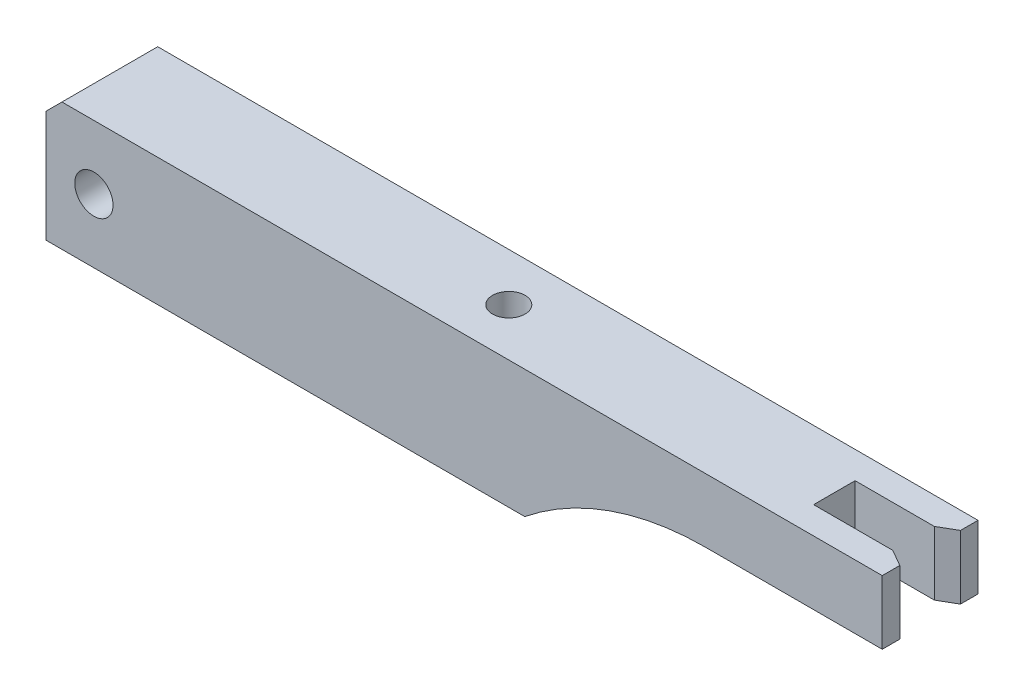
ISO-10303-21;
HEADER;
FILE_DESCRIPTION(('STEP AP214'),'2;1');
FILE_NAME('part.step','',(''),(''),'','','');
FILE_SCHEMA(('AUTOMOTIVE_DESIGN { 1 0 10303 214 1 1 1 1 }'));
ENDSEC;
DATA;
#1=APPLICATION_CONTEXT('core data for automotive mechanical design processes');
#2=APPLICATION_PROTOCOL_DEFINITION('international standard','automotive_design',2000,#1);
#3=PRODUCT_CONTEXT('',#1,'mechanical');
#4=PRODUCT('Part','Part','',(#3));
#5=PRODUCT_RELATED_PRODUCT_CATEGORY('part','',(#4));
#6=PRODUCT_DEFINITION_FORMATION('','',#4);
#7=PRODUCT_DEFINITION_CONTEXT('part definition',#1,'design');
#8=PRODUCT_DEFINITION('design','',#6,#7);
#9=PRODUCT_DEFINITION_SHAPE('','',#8);
#10=(LENGTH_UNIT() NAMED_UNIT(*) SI_UNIT(.MILLI.,.METRE.));
#11=(NAMED_UNIT(*) PLANE_ANGLE_UNIT() SI_UNIT($,.RADIAN.));
#12=(NAMED_UNIT(*) SI_UNIT($,.STERADIAN.) SOLID_ANGLE_UNIT());
#13=UNCERTAINTY_MEASURE_WITH_UNIT(LENGTH_MEASURE(1.E-05),#10,'distance_accuracy_value','');
#14=(GEOMETRIC_REPRESENTATION_CONTEXT(3) GLOBAL_UNCERTAINTY_ASSIGNED_CONTEXT((#13)) GLOBAL_UNIT_ASSIGNED_CONTEXT((#10,
#11,#12)) REPRESENTATION_CONTEXT('',''));
#15=CARTESIAN_POINT('',(0.,0.,0.));
#16=DIRECTION('',(0.,0.,1.));
#17=DIRECTION('',(1.,0.,0.));
#18=AXIS2_PLACEMENT_3D('',#15,#16,#17);
#19=CARTESIAN_POINT('',(132.,40.,15.));
#20=DIRECTION('',(-1.,0.,0.));
#21=DIRECTION('',(0.,0.,1.));
#22=AXIS2_PLACEMENT_3D('',#19,#20,#21);
#23=PLANE('',#22);
#24=DIRECTION('',(0.,0.,-1.));
#25=VECTOR('',#24,1.);
#26=CARTESIAN_POINT('',(132.,40.,15.));
#27=LINE('',#26,#25);
#28=CARTESIAN_POINT('',(132.,40.,-9.5));
#29=VERTEX_POINT('',#28);
#30=CARTESIAN_POINT('',(132.,40.,-15.));
#31=VERTEX_POINT('',#30);
#32=EDGE_CURVE('E244',#29,#31,#27,.T.);
#33=ORIENTED_EDGE('',*,*,#32,.F.);
#34=DIRECTION('',(0.,-1.,0.));
#35=VECTOR('',#34,1.);
#36=CARTESIAN_POINT('',(132.,40.,-9.5));
#37=LINE('',#36,#35);
#38=CARTESIAN_POINT('',(132.,20.,-9.5));
#39=VERTEX_POINT('',#38);
#40=EDGE_CURVE('E11',#29,#39,#37,.T.);
#41=ORIENTED_EDGE('',*,*,#40,.T.);
#42=DIRECTION('',(0.,0.,-1.));
#43=VECTOR('',#42,1.);
#44=CARTESIAN_POINT('',(132.,20.,15.));
#45=LINE('',#44,#43);
#46=CARTESIAN_POINT('',(132.,20.,-15.));
#47=VERTEX_POINT('',#46);
#48=EDGE_CURVE('E248',#39,#47,#45,.T.);
#49=ORIENTED_EDGE('',*,*,#48,.T.);
#50=DIRECTION('',(0.,1.,0.));
#51=VECTOR('',#50,1.);
#52=CARTESIAN_POINT('',(132.,40.,-15.));
#53=LINE('',#52,#51);
#54=EDGE_CURVE('E224',#47,#31,#53,.T.);
#55=ORIENTED_EDGE('',*,*,#54,.T.);
#56=EDGE_LOOP('',(#33,#41,#49,#55));
#57=FACE_BOUND('',#56,.T.);
#58=ADVANCED_FACE('F40',(#57),#23,.F.);
#59=CARTESIAN_POINT('',(76.5685424949238,-70.,15.));
#60=DIRECTION('',(0.,0.,-1.));
#61=DIRECTION('',(-1.,0.,0.));
#62=AXIS2_PLACEMENT_3D('',#59,#60,#61);
#63=CYLINDRICAL_SURFACE('',#62,90.);
#64=CARTESIAN_POINT('',(76.5685424949238,-70.,-15.));
#65=DIRECTION('',(0.,0.,-1.));
#66=DIRECTION('',(1.,0.,0.));
#67=AXIS2_PLACEMENT_3D('',#64,#65,#66);
#68=CIRCLE('',#67,90.);
#69=CARTESIAN_POINT('',(20.,0.,-15.));
#70=VERTEX_POINT('',#69);
#71=CARTESIAN_POINT('',(76.5685424949237,20.,-15.));
#72=VERTEX_POINT('',#71);
#73=EDGE_CURVE('E194',#70,#72,#68,.T.);
#74=ORIENTED_EDGE('',*,*,#73,.T.);
#75=DIRECTION('',(0.,0.,-1.));
#76=VECTOR('',#75,1.);
#77=CARTESIAN_POINT('',(76.5685424949237,20.,15.));
#78=LINE('',#77,#76);
#79=CARTESIAN_POINT('',(76.5685424949237,20.,15.));
#80=VERTEX_POINT('',#79);
#81=EDGE_CURVE('E253',#80,#72,#78,.T.);
#82=ORIENTED_EDGE('',*,*,#81,.F.);
#83=CARTESIAN_POINT('',(76.5685424949238,-70.,15.));
#84=DIRECTION('',(0.,0.,-1.));
#85=DIRECTION('',(1.,0.,0.));
#86=AXIS2_PLACEMENT_3D('',#83,#84,#85);
#87=CIRCLE('',#86,90.);
#88=CARTESIAN_POINT('',(20.,0.,15.));
#89=VERTEX_POINT('',#88);
#90=EDGE_CURVE('E195',#89,#80,#87,.T.);
#91=ORIENTED_EDGE('',*,*,#90,.F.);
#92=DIRECTION('',(0.,0.,-1.));
#93=VECTOR('',#92,1.);
#94=CARTESIAN_POINT('',(20.,0.,15.));
#95=LINE('',#94,#93);
#96=EDGE_CURVE('E216',#89,#70,#95,.T.);
#97=ORIENTED_EDGE('',*,*,#96,.T.);
#98=EDGE_LOOP('',(#74,#82,#91,#97));
#99=FACE_BOUND('',#98,.T.);
#100=ADVANCED_FACE('F371',(#99),#63,.F.);
#101=CARTESIAN_POINT('',(132.,20.,15.));
#102=DIRECTION('',(0.,1.,0.));
#103=DIRECTION('',(-1.,0.,0.));
#104=AXIS2_PLACEMENT_3D('',#101,#102,#103);
#105=PLANE('',#104);
#106=DIRECTION('',(1.,0.,0.));
#107=VECTOR('',#106,1.);
#108=CARTESIAN_POINT('',(132.,20.,6.5));
#109=LINE('',#108,#107);
#110=CARTESIAN_POINT('',(102.,20.,6.5));
#111=VERTEX_POINT('',#110);
#112=CARTESIAN_POINT('',(126.803847577293,20.,6.5));
#113=VERTEX_POINT('',#112);
#114=EDGE_CURVE('E156',#111,#113,#109,.T.);
#115=ORIENTED_EDGE('',*,*,#114,.T.);
#116=DIRECTION('',(-0.866025403784441,0.,-0.499999999999996));
#117=VECTOR('',#116,1.);
#118=CARTESIAN_POINT('',(132.,20.,9.5));
#119=LINE('',#118,#117);
#120=CARTESIAN_POINT('',(132.,20.,9.5));
#121=VERTEX_POINT('',#120);
#122=EDGE_CURVE('E285',#113,#121,#119,.F.);
#123=ORIENTED_EDGE('',*,*,#122,.T.);
#124=CARTESIAN_POINT('',(132.,20.,15.));
#125=VERTEX_POINT('',#124);
#126=EDGE_CURVE('E249',#125,#121,#45,.T.);
#127=ORIENTED_EDGE('',*,*,#126,.F.);
#128=DIRECTION('',(1.,0.,0.));
#129=VECTOR('',#128,1.);
#130=CARTESIAN_POINT('',(132.,20.,15.));
#131=LINE('',#130,#129);
#132=EDGE_CURVE('E199',#80,#125,#131,.T.);
#133=ORIENTED_EDGE('',*,*,#132,.F.);
#134=ORIENTED_EDGE('',*,*,#81,.T.);
#135=DIRECTION('',(1.,0.,0.));
#136=VECTOR('',#135,1.);
#137=CARTESIAN_POINT('',(132.,20.,-15.));
#138=LINE('',#137,#136);
#139=EDGE_CURVE('E220',#72,#47,#138,.T.);
#140=ORIENTED_EDGE('',*,*,#139,.T.);
#141=ORIENTED_EDGE('',*,*,#48,.F.);
#142=DIRECTION('',(0.866025403784441,0.,-0.499999999999996));
#143=VECTOR('',#142,1.);
#144=CARTESIAN_POINT('',(126.803847577293,20.,-6.5));
#145=LINE('',#144,#143);
#146=CARTESIAN_POINT('',(126.803847577293,20.,-6.5));
#147=VERTEX_POINT('',#146);
#148=EDGE_CURVE('E56',#39,#147,#145,.F.);
#149=ORIENTED_EDGE('',*,*,#148,.T.);
#150=DIRECTION('',(-1.,0.,0.));
#151=VECTOR('',#150,1.);
#152=CARTESIAN_POINT('',(132.,20.,-6.5));
#153=LINE('',#152,#151);
#154=CARTESIAN_POINT('',(102.,20.,-6.5));
#155=VERTEX_POINT('',#154);
#156=EDGE_CURVE('E173',#147,#155,#153,.T.);
#157=ORIENTED_EDGE('',*,*,#156,.T.);
#158=DIRECTION('',(0.,0.,1.));
#159=VECTOR('',#158,1.);
#160=CARTESIAN_POINT('',(102.,20.,15.));
#161=LINE('',#160,#159);
#162=EDGE_CURVE('E154',#155,#111,#161,.T.);
#163=ORIENTED_EDGE('',*,*,#162,.T.);
#164=EDGE_LOOP('',(#115,#123,#127,#133,#134,#140,#141,#149,#157,#163));
#165=FACE_BOUND('',#164,.T.);
#166=ADVANCED_FACE('F364',(#165),#105,.F.);
#167=ORIENTED_EDGE('',*,*,#126,.T.);
#168=DIRECTION('',(0.,1.,0.));
#169=VECTOR('',#168,1.);
#170=CARTESIAN_POINT('',(132.,40.,9.5));
#171=LINE('',#170,#169);
#172=CARTESIAN_POINT('',(132.,40.,9.5));
#173=VERTEX_POINT('',#172);
#174=EDGE_CURVE('E270',#121,#173,#171,.T.);
#175=ORIENTED_EDGE('',*,*,#174,.T.);
#176=CARTESIAN_POINT('',(132.,40.,15.));
#177=VERTEX_POINT('',#176);
#178=EDGE_CURVE('E245',#177,#173,#27,.T.);
#179=ORIENTED_EDGE('',*,*,#178,.F.);
#180=DIRECTION('',(0.,1.,0.));
#181=VECTOR('',#180,1.);
#182=CARTESIAN_POINT('',(132.,40.,15.));
#183=LINE('',#182,#181);
#184=EDGE_CURVE('E203',#125,#177,#183,.T.);
#185=ORIENTED_EDGE('',*,*,#184,.F.);
#186=EDGE_LOOP('',(#167,#175,#179,#185));
#187=FACE_BOUND('',#186,.T.);
#188=ADVANCED_FACE('F355',(#187),#23,.F.);
#189=CARTESIAN_POINT('',(-130.,40.,15.));
#190=DIRECTION('',(0.,-1.,0.));
#191=DIRECTION('',(0.,0.,-1.));
#192=AXIS2_PLACEMENT_3D('',#189,#190,#191);
#193=PLANE('',#192);
#194=CARTESIAN_POINT('',(0.,40.,0.));
#195=DIRECTION('',(0.,1.,0.));
#196=DIRECTION('',(0.,0.,1.));
#197=AXIS2_PLACEMENT_3D('',#194,#195,#196);
#198=CIRCLE('',#197,5.09999999999999);
#199=CARTESIAN_POINT('',(0.,40.,5.09999999999999));
#200=VERTEX_POINT('',#199);
#201=EDGE_CURVE('E182',#200,#200,#198,.T.);
#202=ORIENTED_EDGE('',*,*,#201,.F.);
#203=EDGE_LOOP('',(#202));
#204=FACE_BOUND('',#203,.T.);
#205=ORIENTED_EDGE('',*,*,#178,.T.);
#206=DIRECTION('',(0.866025403784441,0.,0.499999999999996));
#207=VECTOR('',#206,1.);
#208=CARTESIAN_POINT('',(132.,40.,9.5));
#209=LINE('',#208,#207);
#210=CARTESIAN_POINT('',(126.803847577293,40.,6.5));
#211=VERTEX_POINT('',#210);
#212=EDGE_CURVE('E277',#173,#211,#209,.F.);
#213=ORIENTED_EDGE('',*,*,#212,.T.);
#214=DIRECTION('',(1.,0.,0.));
#215=VECTOR('',#214,1.);
#216=CARTESIAN_POINT('',(102.,40.,6.5));
#217=LINE('',#216,#215);
#218=CARTESIAN_POINT('',(102.,40.,6.5));
#219=VERTEX_POINT('',#218);
#220=EDGE_CURVE('E145',#219,#211,#217,.T.);
#221=ORIENTED_EDGE('',*,*,#220,.F.);
#222=DIRECTION('',(0.,0.,1.));
#223=VECTOR('',#222,1.);
#224=CARTESIAN_POINT('',(102.,40.,6.5));
#225=LINE('',#224,#223);
#226=CARTESIAN_POINT('',(102.,40.,-6.5));
#227=VERTEX_POINT('',#226);
#228=EDGE_CURVE('E151',#227,#219,#225,.T.);
#229=ORIENTED_EDGE('',*,*,#228,.F.);
#230=DIRECTION('',(-1.,0.,0.));
#231=VECTOR('',#230,1.);
#232=CARTESIAN_POINT('',(102.,40.,-6.5));
#233=LINE('',#232,#231);
#234=CARTESIAN_POINT('',(126.803847577293,40.,-6.5));
#235=VERTEX_POINT('',#234);
#236=EDGE_CURVE('E136',#235,#227,#233,.T.);
#237=ORIENTED_EDGE('',*,*,#236,.F.);
#238=DIRECTION('',(-0.866025403784441,0.,0.499999999999996));
#239=VECTOR('',#238,1.);
#240=CARTESIAN_POINT('',(126.803847577293,40.,-6.5));
#241=LINE('',#240,#239);
#242=EDGE_CURVE('E274',#235,#29,#241,.F.);
#243=ORIENTED_EDGE('',*,*,#242,.T.);
#244=ORIENTED_EDGE('',*,*,#32,.T.);
#245=DIRECTION('',(-1.,0.,0.));
#246=VECTOR('',#245,1.);
#247=CARTESIAN_POINT('',(-130.,40.,-15.));
#248=LINE('',#247,#246);
#249=CARTESIAN_POINT('',(-125.,40.,-15.));
#250=VERTEX_POINT('',#249);
#251=EDGE_CURVE('E228',#31,#250,#248,.T.);
#252=ORIENTED_EDGE('',*,*,#251,.T.);
#253=DIRECTION('',(0.,0.,1.));
#254=VECTOR('',#253,1.);
#255=CARTESIAN_POINT('',(-125.,40.,15.));
#256=LINE('',#255,#254);
#257=CARTESIAN_POINT('',(-125.,40.,15.));
#258=VERTEX_POINT('',#257);
#259=EDGE_CURVE('E264',#250,#258,#256,.T.);
#260=ORIENTED_EDGE('',*,*,#259,.T.);
#261=DIRECTION('',(-1.,0.,0.));
#262=VECTOR('',#261,1.);
#263=CARTESIAN_POINT('',(-130.,40.,15.));
#264=LINE('',#263,#262);
#265=EDGE_CURVE('E206',#177,#258,#264,.T.);
#266=ORIENTED_EDGE('',*,*,#265,.F.);
#267=EDGE_LOOP('',(#205,#213,#221,#229,#237,#243,#244,#252,#260,#266));
#268=FACE_BOUND('',#267,.T.);
#269=ADVANCED_FACE('F160',(#204,#268),#193,.F.);
#270=CARTESIAN_POINT('',(-130.,0.,15.));
#271=DIRECTION('',(1.,0.,0.));
#272=DIRECTION('',(0.,0.,-1.));
#273=AXIS2_PLACEMENT_3D('',#270,#271,#272);
#274=PLANE('',#273);
#275=DIRECTION('',(0.,-1.,0.));
#276=VECTOR('',#275,1.);
#277=CARTESIAN_POINT('',(-130.,0.,15.));
#278=LINE('',#277,#276);
#279=CARTESIAN_POINT('',(-130.,35.,15.));
#280=VERTEX_POINT('',#279);
#281=CARTESIAN_POINT('',(-130.,0.,15.));
#282=VERTEX_POINT('',#281);
#283=EDGE_CURVE('E210',#280,#282,#278,.T.);
#284=ORIENTED_EDGE('',*,*,#283,.F.);
#285=DIRECTION('',(0.,0.,-1.));
#286=VECTOR('',#285,1.);
#287=CARTESIAN_POINT('',(-130.,35.,15.));
#288=LINE('',#287,#286);
#289=CARTESIAN_POINT('',(-130.,35.,-15.));
#290=VERTEX_POINT('',#289);
#291=EDGE_CURVE('E257',#280,#290,#288,.T.);
#292=ORIENTED_EDGE('',*,*,#291,.T.);
#293=DIRECTION('',(0.,-1.,0.));
#294=VECTOR('',#293,1.);
#295=CARTESIAN_POINT('',(-130.,0.,-15.));
#296=LINE('',#295,#294);
#297=CARTESIAN_POINT('',(-130.,0.,-15.));
#298=VERTEX_POINT('',#297);
#299=EDGE_CURVE('E232',#290,#298,#296,.T.);
#300=ORIENTED_EDGE('',*,*,#299,.T.);
#301=DIRECTION('',(0.,0.,-1.));
#302=VECTOR('',#301,1.);
#303=CARTESIAN_POINT('',(-130.,0.,15.));
#304=LINE('',#303,#302);
#305=EDGE_CURVE('E240',#282,#298,#304,.T.);
#306=ORIENTED_EDGE('',*,*,#305,.F.);
#307=EDGE_LOOP('',(#284,#292,#300,#306));
#308=FACE_BOUND('',#307,.T.);
#309=ADVANCED_FACE('F345',(#308),#274,.F.);
#310=CARTESIAN_POINT('',(20.,0.,15.));
#311=DIRECTION('',(0.,1.,0.));
#312=DIRECTION('',(-1.,0.,0.));
#313=AXIS2_PLACEMENT_3D('',#310,#311,#312);
#314=PLANE('',#313);
#315=CARTESIAN_POINT('',(0.,0.,0.));
#316=DIRECTION('',(0.,1.,0.));
#317=DIRECTION('',(0.,0.,1.));
#318=AXIS2_PLACEMENT_3D('',#315,#316,#317);
#319=CIRCLE('',#318,5.09999999999999);
#320=CARTESIAN_POINT('',(0.,0.,5.09999999999999));
#321=VERTEX_POINT('',#320);
#322=EDGE_CURVE('E178',#321,#321,#319,.T.);
#323=ORIENTED_EDGE('',*,*,#322,.T.);
#324=EDGE_LOOP('',(#323));
#325=FACE_BOUND('',#324,.T.);
#326=DIRECTION('',(1.,0.,0.));
#327=VECTOR('',#326,1.);
#328=CARTESIAN_POINT('',(20.,0.,-15.));
#329=LINE('',#328,#327);
#330=EDGE_CURVE('E200',#298,#70,#329,.T.);
#331=ORIENTED_EDGE('',*,*,#330,.T.);
#332=ORIENTED_EDGE('',*,*,#96,.F.);
#333=DIRECTION('',(1.,0.,0.));
#334=VECTOR('',#333,1.);
#335=CARTESIAN_POINT('',(20.,0.,15.));
#336=LINE('',#335,#334);
#337=EDGE_CURVE('E213',#282,#89,#336,.T.);
#338=ORIENTED_EDGE('',*,*,#337,.F.);
#339=ORIENTED_EDGE('',*,*,#305,.T.);
#340=EDGE_LOOP('',(#331,#332,#338,#339));
#341=FACE_BOUND('',#340,.T.);
#342=ADVANCED_FACE('F411',(#325,#341),#314,.F.);
#343=CARTESIAN_POINT('',(76.5685424949238,-70.,15.));
#344=DIRECTION('',(0.,0.,1.));
#345=DIRECTION('',(1.,0.,0.));
#346=AXIS2_PLACEMENT_3D('',#343,#344,#345);
#347=PLANE('',#346);
#348=CARTESIAN_POINT('',(-115.,20.,15.));
#349=DIRECTION('',(0.,0.,1.));
#350=DIRECTION('',(1.,0.,0.));
#351=AXIS2_PLACEMENT_3D('',#348,#349,#350);
#352=CIRCLE('',#351,5.99999999999999);
#353=CARTESIAN_POINT('',(-109.,20.,15.));
#354=VERTEX_POINT('',#353);
#355=EDGE_CURVE('E190',#354,#354,#352,.T.);
#356=ORIENTED_EDGE('',*,*,#355,.F.);
#357=EDGE_LOOP('',(#356));
#358=FACE_BOUND('',#357,.T.);
#359=ORIENTED_EDGE('',*,*,#265,.T.);
#360=DIRECTION('',(0.707106781186549,0.707106781186546,0.));
#361=VECTOR('',#360,1.);
#362=CARTESIAN_POINT('',(-79.2157287525376,85.7842712474622,15.));
#363=LINE('',#362,#361);
#364=EDGE_CURVE('E267',#258,#280,#363,.F.);
#365=ORIENTED_EDGE('',*,*,#364,.T.);
#366=ORIENTED_EDGE('',*,*,#283,.T.);
#367=ORIENTED_EDGE('',*,*,#337,.T.);
#368=ORIENTED_EDGE('',*,*,#90,.T.);
#369=ORIENTED_EDGE('',*,*,#132,.T.);
#370=ORIENTED_EDGE('',*,*,#184,.T.);
#371=EDGE_LOOP('',(#359,#365,#366,#367,#368,#369,#370));
#372=FACE_BOUND('',#371,.T.);
#373=ADVANCED_FACE('F349',(#358,#372),#347,.T.);
#374=CARTESIAN_POINT('',(76.5685424949238,-70.,-15.));
#375=DIRECTION('',(0.,0.,1.));
#376=DIRECTION('',(1.,0.,0.));
#377=AXIS2_PLACEMENT_3D('',#374,#375,#376);
#378=PLANE('',#377);
#379=CARTESIAN_POINT('',(-115.,20.,-15.));
#380=DIRECTION('',(0.,0.,1.));
#381=DIRECTION('',(1.,0.,0.));
#382=AXIS2_PLACEMENT_3D('',#379,#380,#381);
#383=CIRCLE('',#382,5.99999999999999);
#384=CARTESIAN_POINT('',(-109.,20.,-15.));
#385=VERTEX_POINT('',#384);
#386=EDGE_CURVE('E186',#385,#385,#383,.T.);
#387=ORIENTED_EDGE('',*,*,#386,.T.);
#388=EDGE_LOOP('',(#387));
#389=FACE_BOUND('',#388,.T.);
#390=ORIENTED_EDGE('',*,*,#299,.F.);
#391=DIRECTION('',(-0.707106781186549,-0.707106781186546,0.));
#392=VECTOR('',#391,1.);
#393=CARTESIAN_POINT('',(-130.,35.,-15.));
#394=LINE('',#393,#392);
#395=EDGE_CURVE('E261',#290,#250,#394,.F.);
#396=ORIENTED_EDGE('',*,*,#395,.T.);
#397=ORIENTED_EDGE('',*,*,#251,.F.);
#398=ORIENTED_EDGE('',*,*,#54,.F.);
#399=ORIENTED_EDGE('',*,*,#139,.F.);
#400=ORIENTED_EDGE('',*,*,#73,.F.);
#401=ORIENTED_EDGE('',*,*,#330,.F.);
#402=EDGE_LOOP('',(#390,#396,#397,#398,#399,#400,#401));
#403=FACE_BOUND('',#402,.T.);
#404=ADVANCED_FACE('F337',(#389,#403),#378,.F.);
#405=CARTESIAN_POINT('',(-115.,20.,15.));
#406=DIRECTION('',(0.,0.,1.));
#407=DIRECTION('',(1.,0.,0.));
#408=AXIS2_PLACEMENT_3D('',#405,#406,#407);
#409=CYLINDRICAL_SURFACE('',#408,5.99999999999999);
#410=ORIENTED_EDGE('',*,*,#386,.F.);
#411=EDGE_LOOP('',(#410));
#412=FACE_BOUND('',#411,.T.);
#413=ORIENTED_EDGE('',*,*,#355,.T.);
#414=EDGE_LOOP('',(#413));
#415=FACE_BOUND('',#414,.T.);
#416=ADVANCED_FACE('F404',(#412,#415),#409,.F.);
#417=CARTESIAN_POINT('',(0.,40.,0.));
#418=DIRECTION('',(0.,1.,0.));
#419=DIRECTION('',(0.,0.,1.));
#420=AXIS2_PLACEMENT_3D('',#417,#418,#419);
#421=CYLINDRICAL_SURFACE('',#420,5.09999999999999);
#422=ORIENTED_EDGE('',*,*,#322,.F.);
#423=EDGE_LOOP('',(#422));
#424=FACE_BOUND('',#423,.T.);
#425=ORIENTED_EDGE('',*,*,#201,.T.);
#426=EDGE_LOOP('',(#425));
#427=FACE_BOUND('',#426,.T.);
#428=ADVANCED_FACE('F401',(#424,#427),#421,.F.);
#429=CARTESIAN_POINT('',(102.,0.,6.5));
#430=DIRECTION('',(-1.,0.,0.));
#431=DIRECTION('',(0.,0.,1.));
#432=AXIS2_PLACEMENT_3D('',#429,#430,#431);
#433=PLANE('',#432);
#434=DIRECTION('',(0.,1.,0.));
#435=VECTOR('',#434,1.);
#436=CARTESIAN_POINT('',(102.,0.,-6.5));
#437=LINE('',#436,#435);
#438=EDGE_CURVE('E139',#155,#227,#437,.T.);
#439=ORIENTED_EDGE('',*,*,#438,.T.);
#440=ORIENTED_EDGE('',*,*,#228,.T.);
#441=DIRECTION('',(0.,1.,0.));
#442=VECTOR('',#441,1.);
#443=CARTESIAN_POINT('',(102.,0.,6.5));
#444=LINE('',#443,#442);
#445=EDGE_CURVE('E144',#111,#219,#444,.T.);
#446=ORIENTED_EDGE('',*,*,#445,.F.);
#447=ORIENTED_EDGE('',*,*,#162,.F.);
#448=EDGE_LOOP('',(#439,#440,#446,#447));
#449=FACE_BOUND('',#448,.T.);
#450=ADVANCED_FACE('F149',(#449),#433,.F.);
#451=CARTESIAN_POINT('',(102.,0.,-6.5));
#452=DIRECTION('',(0.,0.,-1.));
#453=DIRECTION('',(-1.,0.,0.));
#454=AXIS2_PLACEMENT_3D('',#451,#452,#453);
#455=PLANE('',#454);
#456=ORIENTED_EDGE('',*,*,#156,.F.);
#457=DIRECTION('',(0.,1.,0.));
#458=VECTOR('',#457,1.);
#459=CARTESIAN_POINT('',(126.803847577293,0.,-6.5));
#460=LINE('',#459,#458);
#461=EDGE_CURVE('E49',#147,#235,#460,.T.);
#462=ORIENTED_EDGE('',*,*,#461,.T.);
#463=ORIENTED_EDGE('',*,*,#236,.T.);
#464=ORIENTED_EDGE('',*,*,#438,.F.);
#465=EDGE_LOOP('',(#456,#462,#463,#464));
#466=FACE_BOUND('',#465,.T.);
#467=ADVANCED_FACE('F138',(#466),#455,.F.);
#468=CARTESIAN_POINT('',(102.,0.,6.5));
#469=DIRECTION('',(0.,0.,1.));
#470=DIRECTION('',(1.,0.,0.));
#471=AXIS2_PLACEMENT_3D('',#468,#469,#470);
#472=PLANE('',#471);
#473=ORIENTED_EDGE('',*,*,#220,.T.);
#474=DIRECTION('',(0.,-1.,0.));
#475=VECTOR('',#474,1.);
#476=CARTESIAN_POINT('',(126.803847577293,0.,6.5));
#477=LINE('',#476,#475);
#478=EDGE_CURVE('E280',#211,#113,#477,.T.);
#479=ORIENTED_EDGE('',*,*,#478,.T.);
#480=ORIENTED_EDGE('',*,*,#114,.F.);
#481=ORIENTED_EDGE('',*,*,#445,.T.);
#482=EDGE_LOOP('',(#473,#479,#480,#481));
#483=FACE_BOUND('',#482,.T.);
#484=ADVANCED_FACE('F363',(#483),#472,.F.);
#485=CARTESIAN_POINT('',(-130.,35.,15.));
#486=DIRECTION('',(0.707106781186545,-0.707106781186549,0.));
#487=DIRECTION('',(0.707106781186549,0.707106781186546,0.));
#488=AXIS2_PLACEMENT_3D('',#485,#486,#487);
#489=PLANE('',#488);
#490=ORIENTED_EDGE('',*,*,#364,.F.);
#491=ORIENTED_EDGE('',*,*,#259,.F.);
#492=ORIENTED_EDGE('',*,*,#395,.F.);
#493=ORIENTED_EDGE('',*,*,#291,.F.);
#494=EDGE_LOOP('',(#490,#491,#492,#493));
#495=FACE_BOUND('',#494,.T.);
#496=ADVANCED_FACE('F342',(#495),#489,.F.);
#497=CARTESIAN_POINT('',(132.,40.,9.5));
#498=DIRECTION('',(-0.499999999999996,0.,0.866025403784441));
#499=DIRECTION('',(0.866025403784441,0.,0.499999999999996));
#500=AXIS2_PLACEMENT_3D('',#497,#498,#499);
#501=PLANE('',#500);
#502=ORIENTED_EDGE('',*,*,#122,.F.);
#503=ORIENTED_EDGE('',*,*,#478,.F.);
#504=ORIENTED_EDGE('',*,*,#212,.F.);
#505=ORIENTED_EDGE('',*,*,#174,.F.);
#506=EDGE_LOOP('',(#502,#503,#504,#505));
#507=FACE_BOUND('',#506,.T.);
#508=ADVANCED_FACE('F360',(#507),#501,.F.);
#509=CARTESIAN_POINT('',(126.803847577293,0.,-6.5));
#510=DIRECTION('',(-0.499999999999996,0.,-0.866025403784441));
#511=DIRECTION('',(-0.866025403784441,0.,0.499999999999996));
#512=AXIS2_PLACEMENT_3D('',#509,#510,#511);
#513=PLANE('',#512);
#514=ORIENTED_EDGE('',*,*,#148,.F.);
#515=ORIENTED_EDGE('',*,*,#40,.F.);
#516=ORIENTED_EDGE('',*,*,#242,.F.);
#517=ORIENTED_EDGE('',*,*,#461,.F.);
#518=EDGE_LOOP('',(#514,#515,#516,#517));
#519=FACE_BOUND('',#518,.T.);
#520=ADVANCED_FACE('F42',(#519),#513,.F.);
#521=CLOSED_SHELL('',(#58,#100,#166,#188,#269,#309,#342,#373,#404,#416,#428,#450,#467,#484,#496,
#508,#520));
#522=MANIFOLD_SOLID_BREP('B2',#521);
#523=ADVANCED_BREP_SHAPE_REPRESENTATION('',(#18,#522),#14);
#524=SHAPE_DEFINITION_REPRESENTATION(#9,#523);
ENDSEC;
END-ISO-10303-21;
